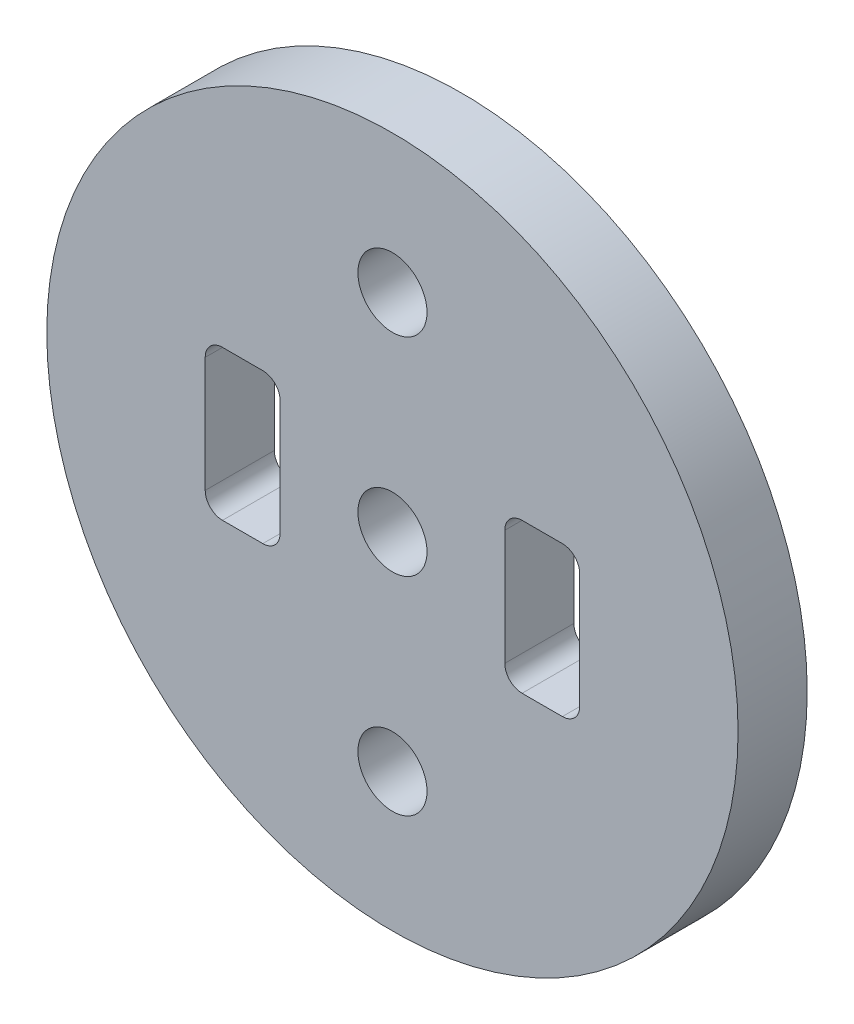
ISO-10303-21;
HEADER;
FILE_DESCRIPTION(('STEP AP214'),'2;1');
FILE_NAME('part.step','',(''),(''),'','','');
FILE_SCHEMA(('AUTOMOTIVE_DESIGN { 1 0 10303 214 1 1 1 1 }'));
ENDSEC;
DATA;
#1=APPLICATION_CONTEXT('core data for automotive mechanical design processes');
#2=APPLICATION_PROTOCOL_DEFINITION('international standard','automotive_design',2000,#1);
#3=PRODUCT_CONTEXT('',#1,'mechanical');
#4=PRODUCT('Part','Part','',(#3));
#5=PRODUCT_RELATED_PRODUCT_CATEGORY('part','',(#4));
#6=PRODUCT_DEFINITION_FORMATION('','',#4);
#7=PRODUCT_DEFINITION_CONTEXT('part definition',#1,'design');
#8=PRODUCT_DEFINITION('design','',#6,#7);
#9=PRODUCT_DEFINITION_SHAPE('','',#8);
#10=(LENGTH_UNIT() NAMED_UNIT(*) SI_UNIT(.MILLI.,.METRE.));
#11=(NAMED_UNIT(*) PLANE_ANGLE_UNIT() SI_UNIT($,.RADIAN.));
#12=(NAMED_UNIT(*) SI_UNIT($,.STERADIAN.) SOLID_ANGLE_UNIT());
#13=UNCERTAINTY_MEASURE_WITH_UNIT(LENGTH_MEASURE(1.E-05),#10,'distance_accuracy_value','');
#14=(GEOMETRIC_REPRESENTATION_CONTEXT(3) GLOBAL_UNCERTAINTY_ASSIGNED_CONTEXT((#13)) GLOBAL_UNIT_ASSIGNED_CONTEXT((#10,
#11,#12)) REPRESENTATION_CONTEXT('',''));
#15=CARTESIAN_POINT('',(0.,0.,0.));
#16=DIRECTION('',(0.,0.,1.));
#17=DIRECTION('',(1.,0.,0.));
#18=AXIS2_PLACEMENT_3D('',#15,#16,#17);
#19=CARTESIAN_POINT('',(215.7478079135,241.9520199932,3.));
#20=DIRECTION('',(0.,0.,1.));
#21=DIRECTION('',(1.,0.,0.));
#22=AXIS2_PLACEMENT_3D('',#19,#20,#21);
#23=PLANE('',#22);
#24=DIRECTION('',(0.,-1.,0.));
#25=VECTOR('',#24,1.);
#26=CARTESIAN_POINT('',(220.6228079135,244.4520199932,3.));
#27=LINE('',#26,#25);
#28=CARTESIAN_POINT('',(220.6228079135,244.4520199932,3.));
#29=VERTEX_POINT('',#28);
#30=CARTESIAN_POINT('',(220.6228079135,239.4520199932,3.));
#31=VERTEX_POINT('',#30);
#32=EDGE_CURVE('E213',#29,#31,#27,.T.);
#33=ORIENTED_EDGE('',*,*,#32,.F.);
#34=CARTESIAN_POINT('',(221.3728079135,244.4520199932,3.));
#35=DIRECTION('',(0.,0.,1.));
#36=DIRECTION('',(1.,0.,0.));
#37=AXIS2_PLACEMENT_3D('',#34,#35,#36);
#38=CIRCLE('',#37,0.750000000000001);
#39=CARTESIAN_POINT('',(221.3728079135,245.2020199932,3.));
#40=VERTEX_POINT('',#39);
#41=EDGE_CURVE('E211',#40,#29,#38,.T.);
#42=ORIENTED_EDGE('',*,*,#41,.F.);
#43=DIRECTION('',(-1.,0.,0.));
#44=VECTOR('',#43,1.);
#45=CARTESIAN_POINT('',(223.1228079135,245.2020199932,3.));
#46=LINE('',#45,#44);
#47=CARTESIAN_POINT('',(223.1228079135,245.2020199932,3.));
#48=VERTEX_POINT('',#47);
#49=EDGE_CURVE('E227',#48,#40,#46,.T.);
#50=ORIENTED_EDGE('',*,*,#49,.F.);
#51=CARTESIAN_POINT('',(223.1228079135,244.4520199932,3.));
#52=DIRECTION('',(0.,0.,1.));
#53=DIRECTION('',(1.,0.,0.));
#54=AXIS2_PLACEMENT_3D('',#51,#52,#53);
#55=CIRCLE('',#54,0.750000000000001);
#56=CARTESIAN_POINT('',(223.8728079135,244.4520199932,3.));
#57=VERTEX_POINT('',#56);
#58=EDGE_CURVE('E224',#57,#48,#55,.T.);
#59=ORIENTED_EDGE('',*,*,#58,.F.);
#60=DIRECTION('',(0.,1.,0.));
#61=VECTOR('',#60,1.);
#62=CARTESIAN_POINT('',(223.8728079135,239.4520199932,3.));
#63=LINE('',#62,#61);
#64=CARTESIAN_POINT('',(223.8728079135,239.4520199932,3.));
#65=VERTEX_POINT('',#64);
#66=EDGE_CURVE('E222',#65,#57,#63,.T.);
#67=ORIENTED_EDGE('',*,*,#66,.F.);
#68=CARTESIAN_POINT('',(223.1228079135,239.4520199932,3.));
#69=DIRECTION('',(0.,0.,1.));
#70=DIRECTION('',(1.,0.,0.));
#71=AXIS2_PLACEMENT_3D('',#68,#69,#70);
#72=CIRCLE('',#71,0.750000000000001);
#73=CARTESIAN_POINT('',(223.1228079135,238.7020199932,3.));
#74=VERTEX_POINT('',#73);
#75=EDGE_CURVE('E220',#74,#65,#72,.T.);
#76=ORIENTED_EDGE('',*,*,#75,.F.);
#77=DIRECTION('',(1.,0.,0.));
#78=VECTOR('',#77,1.);
#79=CARTESIAN_POINT('',(221.3728079135,238.7020199932,3.));
#80=LINE('',#79,#78);
#81=CARTESIAN_POINT('',(221.3728079135,238.7020199932,3.));
#82=VERTEX_POINT('',#81);
#83=EDGE_CURVE('E218',#82,#74,#80,.T.);
#84=ORIENTED_EDGE('',*,*,#83,.F.);
#85=CARTESIAN_POINT('',(221.3728079135,239.4520199932,3.));
#86=DIRECTION('',(0.,0.,1.));
#87=DIRECTION('',(1.,0.,0.));
#88=AXIS2_PLACEMENT_3D('',#85,#86,#87);
#89=CIRCLE('',#88,0.750000000000001);
#90=EDGE_CURVE('E216',#31,#82,#89,.T.);
#91=ORIENTED_EDGE('',*,*,#90,.F.);
#92=EDGE_LOOP('',(#33,#42,#50,#59,#67,#76,#84,#91));
#93=FACE_BOUND('',#92,.T.);
#94=CARTESIAN_POINT('',(215.7478079135,232.9520199932,3.));
#95=DIRECTION('',(0.,0.,1.));
#96=DIRECTION('',(1.,0.,0.));
#97=AXIS2_PLACEMENT_3D('',#94,#95,#96);
#98=CIRCLE('',#97,1.5);
#99=CARTESIAN_POINT('',(217.2478079135,232.9520199932,3.));
#100=VERTEX_POINT('',#99);
#101=EDGE_CURVE('E276',#100,#100,#98,.T.);
#102=ORIENTED_EDGE('',*,*,#101,.F.);
#103=EDGE_LOOP('',(#102));
#104=FACE_BOUND('',#103,.T.);
#105=CARTESIAN_POINT('',(215.7478079135,241.9520199932,3.));
#106=DIRECTION('',(0.,0.,1.));
#107=DIRECTION('',(1.,0.,0.));
#108=AXIS2_PLACEMENT_3D('',#105,#106,#107);
#109=CIRCLE('',#108,15.);
#110=CARTESIAN_POINT('',(230.7478079135,241.9520199932,3.));
#111=VERTEX_POINT('',#110);
#112=EDGE_CURVE('E11',#111,#111,#109,.T.);
#113=ORIENTED_EDGE('',*,*,#112,.T.);
#114=EDGE_LOOP('',(#113));
#115=FACE_BOUND('',#114,.T.);
#116=CARTESIAN_POINT('',(215.7478079135,241.9520199932,3.));
#117=DIRECTION('',(0.,0.,1.));
#118=DIRECTION('',(1.,0.,0.));
#119=AXIS2_PLACEMENT_3D('',#116,#117,#118);
#120=CIRCLE('',#119,1.5);
#121=CARTESIAN_POINT('',(217.2478079135,241.9520199932,3.));
#122=VERTEX_POINT('',#121);
#123=EDGE_CURVE('E282',#122,#122,#120,.T.);
#124=ORIENTED_EDGE('',*,*,#123,.F.);
#125=EDGE_LOOP('',(#124));
#126=FACE_BOUND('',#125,.T.);
#127=CARTESIAN_POINT('',(215.7478079135,250.9520199932,3.));
#128=DIRECTION('',(0.,0.,1.));
#129=DIRECTION('',(1.,0.,0.));
#130=AXIS2_PLACEMENT_3D('',#127,#128,#129);
#131=CIRCLE('',#130,1.5);
#132=CARTESIAN_POINT('',(217.2478079135,250.9520199932,3.));
#133=VERTEX_POINT('',#132);
#134=EDGE_CURVE('E270',#133,#133,#131,.T.);
#135=ORIENTED_EDGE('',*,*,#134,.F.);
#136=EDGE_LOOP('',(#135));
#137=FACE_BOUND('',#136,.T.);
#138=DIRECTION('',(-1.,0.,0.));
#139=VECTOR('',#138,1.);
#140=CARTESIAN_POINT('',(208.3728079135,245.2020199932,3.));
#141=LINE('',#140,#139);
#142=CARTESIAN_POINT('',(210.1228079135,245.2020199932,3.));
#143=VERTEX_POINT('',#142);
#144=CARTESIAN_POINT('',(208.3728079135,245.2020199932,3.));
#145=VERTEX_POINT('',#144);
#146=EDGE_CURVE('E154',#143,#145,#141,.T.);
#147=ORIENTED_EDGE('',*,*,#146,.F.);
#148=CARTESIAN_POINT('',(210.1228079135,244.4520199932,3.));
#149=DIRECTION('',(0.,0.,1.));
#150=DIRECTION('',(1.,0.,0.));
#151=AXIS2_PLACEMENT_3D('',#148,#149,#150);
#152=CIRCLE('',#151,0.750000000000001);
#153=CARTESIAN_POINT('',(210.8728079135,244.4520199932,3.));
#154=VERTEX_POINT('',#153);
#155=EDGE_CURVE('E146',#154,#143,#152,.T.);
#156=ORIENTED_EDGE('',*,*,#155,.F.);
#157=DIRECTION('',(0.,1.,0.));
#158=VECTOR('',#157,1.);
#159=CARTESIAN_POINT('',(210.8728079135,244.4520199932,3.));
#160=LINE('',#159,#158);
#161=CARTESIAN_POINT('',(210.8728079135,239.4520199932,3.));
#162=VERTEX_POINT('',#161);
#163=EDGE_CURVE('E179',#162,#154,#160,.T.);
#164=ORIENTED_EDGE('',*,*,#163,.F.);
#165=CARTESIAN_POINT('',(210.1228079135,239.4520199932,3.));
#166=DIRECTION('',(0.,0.,1.));
#167=DIRECTION('',(1.,0.,0.));
#168=AXIS2_PLACEMENT_3D('',#165,#166,#167);
#169=CIRCLE('',#168,0.750000000000001);
#170=CARTESIAN_POINT('',(210.1228079135,238.7020199932,3.));
#171=VERTEX_POINT('',#170);
#172=EDGE_CURVE('E177',#171,#162,#169,.T.);
#173=ORIENTED_EDGE('',*,*,#172,.F.);
#174=DIRECTION('',(1.,0.,0.));
#175=VECTOR('',#174,1.);
#176=CARTESIAN_POINT('',(210.1228079135,238.7020199932,3.));
#177=LINE('',#176,#175);
#178=CARTESIAN_POINT('',(208.3728079135,238.7020199932,3.));
#179=VERTEX_POINT('',#178);
#180=EDGE_CURVE('E175',#179,#171,#177,.T.);
#181=ORIENTED_EDGE('',*,*,#180,.F.);
#182=CARTESIAN_POINT('',(208.3728079135,239.4520199932,3.));
#183=DIRECTION('',(0.,0.,1.));
#184=DIRECTION('',(1.,0.,0.));
#185=AXIS2_PLACEMENT_3D('',#182,#183,#184);
#186=CIRCLE('',#185,0.750000000000237);
#187=CARTESIAN_POINT('',(207.6228079135,239.4520199932,3.));
#188=VERTEX_POINT('',#187);
#189=EDGE_CURVE('E173',#188,#179,#186,.T.);
#190=ORIENTED_EDGE('',*,*,#189,.F.);
#191=DIRECTION('',(0.,-1.,0.));
#192=VECTOR('',#191,1.);
#193=CARTESIAN_POINT('',(207.6228079135,239.4520199932,3.));
#194=LINE('',#193,#192);
#195=CARTESIAN_POINT('',(207.6228079135,244.4520199932,3.));
#196=VERTEX_POINT('',#195);
#197=EDGE_CURVE('E169',#196,#188,#194,.T.);
#198=ORIENTED_EDGE('',*,*,#197,.F.);
#199=CARTESIAN_POINT('',(208.3728079135,244.4520199932,3.));
#200=DIRECTION('',(0.,0.,1.));
#201=DIRECTION('',(1.,0.,0.));
#202=AXIS2_PLACEMENT_3D('',#199,#200,#201);
#203=CIRCLE('',#202,0.750000000000001);
#204=EDGE_CURVE('E167',#145,#196,#203,.T.);
#205=ORIENTED_EDGE('',*,*,#204,.F.);
#206=EDGE_LOOP('',(#147,#156,#164,#173,#181,#190,#198,#205));
#207=FACE_BOUND('',#206,.T.);
#208=ADVANCED_FACE('F33',(#93,#104,#115,#126,#137,#207),#23,.T.);
#209=CARTESIAN_POINT('',(215.7478079135,241.9520199932,0.));
#210=DIRECTION('',(0.,0.,1.));
#211=DIRECTION('',(1.,0.,0.));
#212=AXIS2_PLACEMENT_3D('',#209,#210,#211);
#213=PLANE('',#212);
#214=CARTESIAN_POINT('',(221.3728079135,244.4520199932,0.));
#215=DIRECTION('',(0.,0.,1.));
#216=DIRECTION('',(1.,0.,0.));
#217=AXIS2_PLACEMENT_3D('',#214,#215,#216);
#218=CIRCLE('',#217,0.750000000000001);
#219=CARTESIAN_POINT('',(221.3728079135,245.2020199932,0.));
#220=VERTEX_POINT('',#219);
#221=CARTESIAN_POINT('',(220.6228079135,244.4520199932,0.));
#222=VERTEX_POINT('',#221);
#223=EDGE_CURVE('E162',#220,#222,#218,.T.);
#224=ORIENTED_EDGE('',*,*,#223,.T.);
#225=DIRECTION('',(0.,-1.,0.));
#226=VECTOR('',#225,1.);
#227=CARTESIAN_POINT('',(220.6228079135,244.4520199932,0.));
#228=LINE('',#227,#226);
#229=CARTESIAN_POINT('',(220.6228079135,239.4520199932,0.));
#230=VERTEX_POINT('',#229);
#231=EDGE_CURVE('E232',#222,#230,#228,.T.);
#232=ORIENTED_EDGE('',*,*,#231,.T.);
#233=CARTESIAN_POINT('',(221.3728079135,239.4520199932,0.));
#234=DIRECTION('',(0.,0.,1.));
#235=DIRECTION('',(1.,0.,0.));
#236=AXIS2_PLACEMENT_3D('',#233,#234,#235);
#237=CIRCLE('',#236,0.750000000000001);
#238=CARTESIAN_POINT('',(221.3728079135,238.7020199932,0.));
#239=VERTEX_POINT('',#238);
#240=EDGE_CURVE('E235',#230,#239,#237,.T.);
#241=ORIENTED_EDGE('',*,*,#240,.T.);
#242=DIRECTION('',(1.,0.,0.));
#243=VECTOR('',#242,1.);
#244=CARTESIAN_POINT('',(221.3728079135,238.7020199932,0.));
#245=LINE('',#244,#243);
#246=CARTESIAN_POINT('',(223.1228079135,238.7020199932,0.));
#247=VERTEX_POINT('',#246);
#248=EDGE_CURVE('E238',#239,#247,#245,.T.);
#249=ORIENTED_EDGE('',*,*,#248,.T.);
#250=CARTESIAN_POINT('',(223.1228079135,239.4520199932,0.));
#251=DIRECTION('',(0.,0.,1.));
#252=DIRECTION('',(1.,0.,0.));
#253=AXIS2_PLACEMENT_3D('',#250,#251,#252);
#254=CIRCLE('',#253,0.750000000000001);
#255=CARTESIAN_POINT('',(223.8728079135,239.4520199932,0.));
#256=VERTEX_POINT('',#255);
#257=EDGE_CURVE('E241',#247,#256,#254,.T.);
#258=ORIENTED_EDGE('',*,*,#257,.T.);
#259=DIRECTION('',(0.,1.,0.));
#260=VECTOR('',#259,1.);
#261=CARTESIAN_POINT('',(223.8728079135,239.4520199932,0.));
#262=LINE('',#261,#260);
#263=CARTESIAN_POINT('',(223.8728079135,244.4520199932,0.));
#264=VERTEX_POINT('',#263);
#265=EDGE_CURVE('E244',#256,#264,#262,.T.);
#266=ORIENTED_EDGE('',*,*,#265,.T.);
#267=CARTESIAN_POINT('',(223.1228079135,244.4520199932,0.));
#268=DIRECTION('',(0.,0.,1.));
#269=DIRECTION('',(1.,0.,0.));
#270=AXIS2_PLACEMENT_3D('',#267,#268,#269);
#271=CIRCLE('',#270,0.750000000000001);
#272=CARTESIAN_POINT('',(223.1228079135,245.2020199932,0.));
#273=VERTEX_POINT('',#272);
#274=EDGE_CURVE('E247',#264,#273,#271,.T.);
#275=ORIENTED_EDGE('',*,*,#274,.T.);
#276=DIRECTION('',(-1.,0.,0.));
#277=VECTOR('',#276,1.);
#278=CARTESIAN_POINT('',(223.1228079135,245.2020199932,0.));
#279=LINE('',#278,#277);
#280=EDGE_CURVE('E214',#273,#220,#279,.T.);
#281=ORIENTED_EDGE('',*,*,#280,.T.);
#282=EDGE_LOOP('',(#224,#232,#241,#249,#258,#266,#275,#281));
#283=FACE_BOUND('',#282,.T.);
#284=CARTESIAN_POINT('',(215.7478079135,232.9520199932,0.));
#285=DIRECTION('',(0.,0.,1.));
#286=DIRECTION('',(1.,0.,0.));
#287=AXIS2_PLACEMENT_3D('',#284,#285,#286);
#288=CIRCLE('',#287,1.5);
#289=CARTESIAN_POINT('',(217.2478079135,232.9520199932,0.));
#290=VERTEX_POINT('',#289);
#291=EDGE_CURVE('E273',#290,#290,#288,.T.);
#292=ORIENTED_EDGE('',*,*,#291,.T.);
#293=EDGE_LOOP('',(#292));
#294=FACE_BOUND('',#293,.T.);
#295=CARTESIAN_POINT('',(215.7478079135,241.9520199932,0.));
#296=DIRECTION('',(0.,0.,1.));
#297=DIRECTION('',(1.,0.,0.));
#298=AXIS2_PLACEMENT_3D('',#295,#296,#297);
#299=CIRCLE('',#298,15.);
#300=CARTESIAN_POINT('',(230.7478079135,241.9520199932,0.));
#301=VERTEX_POINT('',#300);
#302=EDGE_CURVE('E37',#301,#301,#299,.T.);
#303=ORIENTED_EDGE('',*,*,#302,.F.);
#304=EDGE_LOOP('',(#303));
#305=FACE_BOUND('',#304,.T.);
#306=CARTESIAN_POINT('',(215.7478079135,241.9520199932,0.));
#307=DIRECTION('',(0.,0.,1.));
#308=DIRECTION('',(1.,0.,0.));
#309=AXIS2_PLACEMENT_3D('',#306,#307,#308);
#310=CIRCLE('',#309,1.5);
#311=CARTESIAN_POINT('',(217.2478079135,241.9520199932,0.));
#312=VERTEX_POINT('',#311);
#313=EDGE_CURVE('E279',#312,#312,#310,.T.);
#314=ORIENTED_EDGE('',*,*,#313,.T.);
#315=EDGE_LOOP('',(#314));
#316=FACE_BOUND('',#315,.T.);
#317=CARTESIAN_POINT('',(215.7478079135,250.9520199932,0.));
#318=DIRECTION('',(0.,0.,1.));
#319=DIRECTION('',(1.,0.,0.));
#320=AXIS2_PLACEMENT_3D('',#317,#318,#319);
#321=CIRCLE('',#320,1.5);
#322=CARTESIAN_POINT('',(217.2478079135,250.9520199932,0.));
#323=VERTEX_POINT('',#322);
#324=EDGE_CURVE('E269',#323,#323,#321,.T.);
#325=ORIENTED_EDGE('',*,*,#324,.T.);
#326=EDGE_LOOP('',(#325));
#327=FACE_BOUND('',#326,.T.);
#328=CARTESIAN_POINT('',(210.1228079135,244.4520199932,0.));
#329=DIRECTION('',(0.,0.,1.));
#330=DIRECTION('',(1.,0.,0.));
#331=AXIS2_PLACEMENT_3D('',#328,#329,#330);
#332=CIRCLE('',#331,0.750000000000001);
#333=CARTESIAN_POINT('',(210.8728079135,244.4520199932,0.));
#334=VERTEX_POINT('',#333);
#335=CARTESIAN_POINT('',(210.1228079135,245.2020199932,0.));
#336=VERTEX_POINT('',#335);
#337=EDGE_CURVE('E56',#334,#336,#332,.T.);
#338=ORIENTED_EDGE('',*,*,#337,.T.);
#339=DIRECTION('',(-1.,0.,0.));
#340=VECTOR('',#339,1.);
#341=CARTESIAN_POINT('',(208.3728079135,245.2020199932,0.));
#342=LINE('',#341,#340);
#343=CARTESIAN_POINT('',(208.3728079135,245.2020199932,0.));
#344=VERTEX_POINT('',#343);
#345=EDGE_CURVE('E161',#336,#344,#342,.T.);
#346=ORIENTED_EDGE('',*,*,#345,.T.);
#347=CARTESIAN_POINT('',(208.3728079135,244.4520199932,0.));
#348=DIRECTION('',(0.,0.,1.));
#349=DIRECTION('',(1.,0.,0.));
#350=AXIS2_PLACEMENT_3D('',#347,#348,#349);
#351=CIRCLE('',#350,0.750000000000001);
#352=CARTESIAN_POINT('',(207.6228079135,244.4520199932,0.));
#353=VERTEX_POINT('',#352);
#354=EDGE_CURVE('E183',#344,#353,#351,.T.);
#355=ORIENTED_EDGE('',*,*,#354,.T.);
#356=DIRECTION('',(0.,-1.,0.));
#357=VECTOR('',#356,1.);
#358=CARTESIAN_POINT('',(207.6228079135,239.4520199932,0.));
#359=LINE('',#358,#357);
#360=CARTESIAN_POINT('',(207.6228079135,239.4520199932,0.));
#361=VERTEX_POINT('',#360);
#362=EDGE_CURVE('E186',#353,#361,#359,.T.);
#363=ORIENTED_EDGE('',*,*,#362,.T.);
#364=CARTESIAN_POINT('',(208.3728079135,239.4520199932,0.));
#365=DIRECTION('',(0.,0.,1.));
#366=DIRECTION('',(1.,0.,0.));
#367=AXIS2_PLACEMENT_3D('',#364,#365,#366);
#368=CIRCLE('',#367,0.750000000000237);
#369=CARTESIAN_POINT('',(208.3728079135,238.7020199932,0.));
#370=VERTEX_POINT('',#369);
#371=EDGE_CURVE('E189',#361,#370,#368,.T.);
#372=ORIENTED_EDGE('',*,*,#371,.T.);
#373=DIRECTION('',(1.,0.,0.));
#374=VECTOR('',#373,1.);
#375=CARTESIAN_POINT('',(210.1228079135,238.7020199932,0.));
#376=LINE('',#375,#374);
#377=CARTESIAN_POINT('',(210.1228079135,238.7020199932,0.));
#378=VERTEX_POINT('',#377);
#379=EDGE_CURVE('E192',#370,#378,#376,.T.);
#380=ORIENTED_EDGE('',*,*,#379,.T.);
#381=CARTESIAN_POINT('',(210.1228079135,239.4520199932,0.));
#382=DIRECTION('',(0.,0.,1.));
#383=DIRECTION('',(1.,0.,0.));
#384=AXIS2_PLACEMENT_3D('',#381,#382,#383);
#385=CIRCLE('',#384,0.750000000000001);
#386=CARTESIAN_POINT('',(210.8728079135,239.4520199932,0.));
#387=VERTEX_POINT('',#386);
#388=EDGE_CURVE('E195',#378,#387,#385,.T.);
#389=ORIENTED_EDGE('',*,*,#388,.T.);
#390=DIRECTION('',(0.,1.,0.));
#391=VECTOR('',#390,1.);
#392=CARTESIAN_POINT('',(210.8728079135,244.4520199932,0.));
#393=LINE('',#392,#391);
#394=EDGE_CURVE('E155',#387,#334,#393,.T.);
#395=ORIENTED_EDGE('',*,*,#394,.T.);
#396=EDGE_LOOP('',(#338,#346,#355,#363,#372,#380,#389,#395));
#397=FACE_BOUND('',#396,.T.);
#398=ADVANCED_FACE('F288',(#283,#294,#305,#316,#327,#397),#213,.F.);
#399=CARTESIAN_POINT('',(215.7478079135,241.9520199932,3.));
#400=DIRECTION('',(0.,0.,-1.));
#401=DIRECTION('',(-1.,0.,0.));
#402=AXIS2_PLACEMENT_3D('',#399,#400,#401);
#403=CYLINDRICAL_SURFACE('',#402,15.);
#404=ORIENTED_EDGE('',*,*,#112,.F.);
#405=EDGE_LOOP('',(#404));
#406=FACE_BOUND('',#405,.T.);
#407=ORIENTED_EDGE('',*,*,#302,.T.);
#408=EDGE_LOOP('',(#407));
#409=FACE_BOUND('',#408,.T.);
#410=ADVANCED_FACE('F35',(#406,#409),#403,.T.);
#411=CARTESIAN_POINT('',(215.7478079135,241.9520199932,3.));
#412=DIRECTION('',(0.,0.,-1.));
#413=DIRECTION('',(-1.,0.,0.));
#414=AXIS2_PLACEMENT_3D('',#411,#412,#413);
#415=CYLINDRICAL_SURFACE('',#414,1.5);
#416=ORIENTED_EDGE('',*,*,#123,.T.);
#417=EDGE_LOOP('',(#416));
#418=FACE_BOUND('',#417,.T.);
#419=ORIENTED_EDGE('',*,*,#313,.F.);
#420=EDGE_LOOP('',(#419));
#421=FACE_BOUND('',#420,.T.);
#422=ADVANCED_FACE('F291',(#418,#421),#415,.F.);
#423=CARTESIAN_POINT('',(215.7478079135,232.9520199932,3.));
#424=DIRECTION('',(0.,0.,-1.));
#425=DIRECTION('',(-1.,0.,0.));
#426=AXIS2_PLACEMENT_3D('',#423,#424,#425);
#427=CYLINDRICAL_SURFACE('',#426,1.5);
#428=ORIENTED_EDGE('',*,*,#101,.T.);
#429=EDGE_LOOP('',(#428));
#430=FACE_BOUND('',#429,.T.);
#431=ORIENTED_EDGE('',*,*,#291,.F.);
#432=EDGE_LOOP('',(#431));
#433=FACE_BOUND('',#432,.T.);
#434=ADVANCED_FACE('F293',(#430,#433),#427,.F.);
#435=CARTESIAN_POINT('',(215.7478079135,250.9520199932,3.));
#436=DIRECTION('',(0.,0.,-1.));
#437=DIRECTION('',(-1.,0.,0.));
#438=AXIS2_PLACEMENT_3D('',#435,#436,#437);
#439=CYLINDRICAL_SURFACE('',#438,1.5);
#440=ORIENTED_EDGE('',*,*,#134,.T.);
#441=EDGE_LOOP('',(#440));
#442=FACE_BOUND('',#441,.T.);
#443=ORIENTED_EDGE('',*,*,#324,.F.);
#444=EDGE_LOOP('',(#443));
#445=FACE_BOUND('',#444,.T.);
#446=ADVANCED_FACE('F300',(#442,#445),#439,.F.);
#447=CARTESIAN_POINT('',(221.3728079135,244.4520199932,3.));
#448=DIRECTION('',(0.,0.,-1.));
#449=DIRECTION('',(-1.,0.,0.));
#450=AXIS2_PLACEMENT_3D('',#447,#448,#449);
#451=CYLINDRICAL_SURFACE('',#450,0.750000000000001);
#452=ORIENTED_EDGE('',*,*,#223,.F.);
#453=DIRECTION('',(0.,0.,-1.));
#454=VECTOR('',#453,1.);
#455=CARTESIAN_POINT('',(221.3728079135,245.2020199932,3.));
#456=LINE('',#455,#454);
#457=EDGE_CURVE('E229',#40,#220,#456,.T.);
#458=ORIENTED_EDGE('',*,*,#457,.F.);
#459=ORIENTED_EDGE('',*,*,#41,.T.);
#460=DIRECTION('',(0.,0.,-1.));
#461=VECTOR('',#460,1.);
#462=CARTESIAN_POINT('',(220.6228079135,244.4520199932,3.));
#463=LINE('',#462,#461);
#464=EDGE_CURVE('E266',#29,#222,#463,.T.);
#465=ORIENTED_EDGE('',*,*,#464,.T.);
#466=EDGE_LOOP('',(#452,#458,#459,#465));
#467=FACE_BOUND('',#466,.T.);
#468=ADVANCED_FACE('F325',(#467),#451,.F.);
#469=CARTESIAN_POINT('',(220.6228079135,244.4520199932,3.));
#470=DIRECTION('',(1.,0.,0.));
#471=DIRECTION('',(0.,0.,-1.));
#472=AXIS2_PLACEMENT_3D('',#469,#470,#471);
#473=PLANE('',#472);
#474=ORIENTED_EDGE('',*,*,#231,.F.);
#475=ORIENTED_EDGE('',*,*,#464,.F.);
#476=ORIENTED_EDGE('',*,*,#32,.T.);
#477=DIRECTION('',(0.,0.,-1.));
#478=VECTOR('',#477,1.);
#479=CARTESIAN_POINT('',(220.6228079135,239.4520199932,3.));
#480=LINE('',#479,#478);
#481=EDGE_CURVE('E264',#31,#230,#480,.T.);
#482=ORIENTED_EDGE('',*,*,#481,.T.);
#483=EDGE_LOOP('',(#474,#475,#476,#482));
#484=FACE_BOUND('',#483,.T.);
#485=ADVANCED_FACE('F387',(#484),#473,.T.);
#486=CARTESIAN_POINT('',(221.3728079135,239.4520199932,3.));
#487=DIRECTION('',(0.,0.,-1.));
#488=DIRECTION('',(-1.,0.,0.));
#489=AXIS2_PLACEMENT_3D('',#486,#487,#488);
#490=CYLINDRICAL_SURFACE('',#489,0.750000000000001);
#491=ORIENTED_EDGE('',*,*,#240,.F.);
#492=ORIENTED_EDGE('',*,*,#481,.F.);
#493=ORIENTED_EDGE('',*,*,#90,.T.);
#494=DIRECTION('',(0.,0.,-1.));
#495=VECTOR('',#494,1.);
#496=CARTESIAN_POINT('',(221.3728079135,238.7020199932,3.));
#497=LINE('',#496,#495);
#498=EDGE_CURVE('E262',#82,#239,#497,.T.);
#499=ORIENTED_EDGE('',*,*,#498,.T.);
#500=EDGE_LOOP('',(#491,#492,#493,#499));
#501=FACE_BOUND('',#500,.T.);
#502=ADVANCED_FACE('F383',(#501),#490,.F.);
#503=CARTESIAN_POINT('',(221.3728079135,238.7020199932,3.));
#504=DIRECTION('',(0.,1.,0.));
#505=DIRECTION('',(0.,0.,1.));
#506=AXIS2_PLACEMENT_3D('',#503,#504,#505);
#507=PLANE('',#506);
#508=ORIENTED_EDGE('',*,*,#248,.F.);
#509=ORIENTED_EDGE('',*,*,#498,.F.);
#510=ORIENTED_EDGE('',*,*,#83,.T.);
#511=DIRECTION('',(0.,0.,-1.));
#512=VECTOR('',#511,1.);
#513=CARTESIAN_POINT('',(223.1228079135,238.7020199932,3.));
#514=LINE('',#513,#512);
#515=EDGE_CURVE('E260',#74,#247,#514,.T.);
#516=ORIENTED_EDGE('',*,*,#515,.T.);
#517=EDGE_LOOP('',(#508,#509,#510,#516));
#518=FACE_BOUND('',#517,.T.);
#519=ADVANCED_FACE('F379',(#518),#507,.T.);
#520=CARTESIAN_POINT('',(223.1228079135,239.4520199932,3.));
#521=DIRECTION('',(0.,0.,-1.));
#522=DIRECTION('',(-1.,0.,0.));
#523=AXIS2_PLACEMENT_3D('',#520,#521,#522);
#524=CYLINDRICAL_SURFACE('',#523,0.750000000000001);
#525=ORIENTED_EDGE('',*,*,#257,.F.);
#526=ORIENTED_EDGE('',*,*,#515,.F.);
#527=ORIENTED_EDGE('',*,*,#75,.T.);
#528=DIRECTION('',(0.,0.,-1.));
#529=VECTOR('',#528,1.);
#530=CARTESIAN_POINT('',(223.8728079135,239.4520199932,3.));
#531=LINE('',#530,#529);
#532=EDGE_CURVE('E258',#65,#256,#531,.T.);
#533=ORIENTED_EDGE('',*,*,#532,.T.);
#534=EDGE_LOOP('',(#525,#526,#527,#533));
#535=FACE_BOUND('',#534,.T.);
#536=ADVANCED_FACE('F375',(#535),#524,.F.);
#537=CARTESIAN_POINT('',(223.8728079135,239.4520199932,3.));
#538=DIRECTION('',(-1.,0.,0.));
#539=DIRECTION('',(0.,0.,1.));
#540=AXIS2_PLACEMENT_3D('',#537,#538,#539);
#541=PLANE('',#540);
#542=ORIENTED_EDGE('',*,*,#265,.F.);
#543=ORIENTED_EDGE('',*,*,#532,.F.);
#544=ORIENTED_EDGE('',*,*,#66,.T.);
#545=DIRECTION('',(0.,0.,-1.));
#546=VECTOR('',#545,1.);
#547=CARTESIAN_POINT('',(223.8728079135,244.4520199932,3.));
#548=LINE('',#547,#546);
#549=EDGE_CURVE('E256',#57,#264,#548,.T.);
#550=ORIENTED_EDGE('',*,*,#549,.T.);
#551=EDGE_LOOP('',(#542,#543,#544,#550));
#552=FACE_BOUND('',#551,.T.);
#553=ADVANCED_FACE('F371',(#552),#541,.T.);
#554=CARTESIAN_POINT('',(223.1228079135,244.4520199932,3.));
#555=DIRECTION('',(0.,0.,-1.));
#556=DIRECTION('',(-1.,0.,0.));
#557=AXIS2_PLACEMENT_3D('',#554,#555,#556);
#558=CYLINDRICAL_SURFACE('',#557,0.750000000000001);
#559=ORIENTED_EDGE('',*,*,#274,.F.);
#560=ORIENTED_EDGE('',*,*,#549,.F.);
#561=ORIENTED_EDGE('',*,*,#58,.T.);
#562=DIRECTION('',(0.,0.,-1.));
#563=VECTOR('',#562,1.);
#564=CARTESIAN_POINT('',(223.1228079135,245.2020199932,3.));
#565=LINE('',#564,#563);
#566=EDGE_CURVE('E254',#48,#273,#565,.T.);
#567=ORIENTED_EDGE('',*,*,#566,.T.);
#568=EDGE_LOOP('',(#559,#560,#561,#567));
#569=FACE_BOUND('',#568,.T.);
#570=ADVANCED_FACE('F367',(#569),#558,.F.);
#571=CARTESIAN_POINT('',(223.1228079135,245.2020199932,3.));
#572=DIRECTION('',(0.,-1.,0.));
#573=DIRECTION('',(0.,0.,-1.));
#574=AXIS2_PLACEMENT_3D('',#571,#572,#573);
#575=PLANE('',#574);
#576=ORIENTED_EDGE('',*,*,#280,.F.);
#577=ORIENTED_EDGE('',*,*,#566,.F.);
#578=ORIENTED_EDGE('',*,*,#49,.T.);
#579=ORIENTED_EDGE('',*,*,#457,.T.);
#580=EDGE_LOOP('',(#576,#577,#578,#579));
#581=FACE_BOUND('',#580,.T.);
#582=ADVANCED_FACE('F364',(#581),#575,.T.);
#583=CARTESIAN_POINT('',(210.1228079135,244.4520199932,3.));
#584=DIRECTION('',(0.,0.,-1.));
#585=DIRECTION('',(-1.,0.,0.));
#586=AXIS2_PLACEMENT_3D('',#583,#584,#585);
#587=CYLINDRICAL_SURFACE('',#586,0.750000000000001);
#588=ORIENTED_EDGE('',*,*,#337,.F.);
#589=DIRECTION('',(0.,0.,-1.));
#590=VECTOR('',#589,1.);
#591=CARTESIAN_POINT('',(210.8728079135,244.4520199932,3.));
#592=LINE('',#591,#590);
#593=EDGE_CURVE('E150',#154,#334,#592,.T.);
#594=ORIENTED_EDGE('',*,*,#593,.F.);
#595=ORIENTED_EDGE('',*,*,#155,.T.);
#596=DIRECTION('',(0.,0.,-1.));
#597=VECTOR('',#596,1.);
#598=CARTESIAN_POINT('',(210.1228079135,245.2020199932,3.));
#599=LINE('',#598,#597);
#600=EDGE_CURVE('E149',#143,#336,#599,.T.);
#601=ORIENTED_EDGE('',*,*,#600,.T.);
#602=EDGE_LOOP('',(#588,#594,#595,#601));
#603=FACE_BOUND('',#602,.T.);
#604=ADVANCED_FACE('F148',(#603),#587,.F.);
#605=CARTESIAN_POINT('',(208.3728079135,245.2020199932,3.));
#606=DIRECTION('',(0.,-1.,0.));
#607=DIRECTION('',(0.,0.,-1.));
#608=AXIS2_PLACEMENT_3D('',#605,#606,#607);
#609=PLANE('',#608);
#610=ORIENTED_EDGE('',*,*,#345,.F.);
#611=ORIENTED_EDGE('',*,*,#600,.F.);
#612=ORIENTED_EDGE('',*,*,#146,.T.);
#613=DIRECTION('',(0.,0.,-1.));
#614=VECTOR('',#613,1.);
#615=CARTESIAN_POINT('',(208.3728079135,245.2020199932,3.));
#616=LINE('',#615,#614);
#617=EDGE_CURVE('E163',#145,#344,#616,.T.);
#618=ORIENTED_EDGE('',*,*,#617,.T.);
#619=EDGE_LOOP('',(#610,#611,#612,#618));
#620=FACE_BOUND('',#619,.T.);
#621=ADVANCED_FACE('F158',(#620),#609,.T.);
#622=CARTESIAN_POINT('',(208.3728079135,244.4520199932,3.));
#623=DIRECTION('',(0.,0.,-1.));
#624=DIRECTION('',(-1.,0.,0.));
#625=AXIS2_PLACEMENT_3D('',#622,#623,#624);
#626=CYLINDRICAL_SURFACE('',#625,0.750000000000001);
#627=ORIENTED_EDGE('',*,*,#354,.F.);
#628=ORIENTED_EDGE('',*,*,#617,.F.);
#629=ORIENTED_EDGE('',*,*,#204,.T.);
#630=DIRECTION('',(0.,0.,-1.));
#631=VECTOR('',#630,1.);
#632=CARTESIAN_POINT('',(207.6228079135,244.4520199932,3.));
#633=LINE('',#632,#631);
#634=EDGE_CURVE('E208',#196,#353,#633,.T.);
#635=ORIENTED_EDGE('',*,*,#634,.T.);
#636=EDGE_LOOP('',(#627,#628,#629,#635));
#637=FACE_BOUND('',#636,.T.);
#638=ADVANCED_FACE('F351',(#637),#626,.F.);
#639=CARTESIAN_POINT('',(207.6228079135,239.4520199932,3.));
#640=DIRECTION('',(1.,0.,0.));
#641=DIRECTION('',(0.,0.,-1.));
#642=AXIS2_PLACEMENT_3D('',#639,#640,#641);
#643=PLANE('',#642);
#644=ORIENTED_EDGE('',*,*,#362,.F.);
#645=ORIENTED_EDGE('',*,*,#634,.F.);
#646=ORIENTED_EDGE('',*,*,#197,.T.);
#647=DIRECTION('',(0.,0.,-1.));
#648=VECTOR('',#647,1.);
#649=CARTESIAN_POINT('',(207.6228079135,239.4520199932,3.));
#650=LINE('',#649,#648);
#651=EDGE_CURVE('E206',#188,#361,#650,.T.);
#652=ORIENTED_EDGE('',*,*,#651,.T.);
#653=EDGE_LOOP('',(#644,#645,#646,#652));
#654=FACE_BOUND('',#653,.T.);
#655=ADVANCED_FACE('F348',(#654),#643,.T.);
#656=CARTESIAN_POINT('',(208.3728079135,239.4520199932,3.));
#657=DIRECTION('',(0.,0.,-1.));
#658=DIRECTION('',(-1.,0.,0.));
#659=AXIS2_PLACEMENT_3D('',#656,#657,#658);
#660=CYLINDRICAL_SURFACE('',#659,0.750000000000237);
#661=ORIENTED_EDGE('',*,*,#371,.F.);
#662=ORIENTED_EDGE('',*,*,#651,.F.);
#663=ORIENTED_EDGE('',*,*,#189,.T.);
#664=DIRECTION('',(0.,0.,-1.));
#665=VECTOR('',#664,1.);
#666=CARTESIAN_POINT('',(208.3728079135,238.7020199932,3.));
#667=LINE('',#666,#665);
#668=EDGE_CURVE('E204',#179,#370,#667,.T.);
#669=ORIENTED_EDGE('',*,*,#668,.T.);
#670=EDGE_LOOP('',(#661,#662,#663,#669));
#671=FACE_BOUND('',#670,.T.);
#672=ADVANCED_FACE('F343',(#671),#660,.F.);
#673=CARTESIAN_POINT('',(210.1228079135,238.7020199932,3.));
#674=DIRECTION('',(0.,1.,0.));
#675=DIRECTION('',(0.,0.,1.));
#676=AXIS2_PLACEMENT_3D('',#673,#674,#675);
#677=PLANE('',#676);
#678=ORIENTED_EDGE('',*,*,#379,.F.);
#679=ORIENTED_EDGE('',*,*,#668,.F.);
#680=ORIENTED_EDGE('',*,*,#180,.T.);
#681=DIRECTION('',(0.,0.,-1.));
#682=VECTOR('',#681,1.);
#683=CARTESIAN_POINT('',(210.1228079135,238.7020199932,3.));
#684=LINE('',#683,#682);
#685=EDGE_CURVE('E202',#171,#378,#684,.T.);
#686=ORIENTED_EDGE('',*,*,#685,.T.);
#687=EDGE_LOOP('',(#678,#679,#680,#686));
#688=FACE_BOUND('',#687,.T.);
#689=ADVANCED_FACE('F339',(#688),#677,.T.);
#690=CARTESIAN_POINT('',(210.1228079135,239.4520199932,3.));
#691=DIRECTION('',(0.,0.,-1.));
#692=DIRECTION('',(-1.,0.,0.));
#693=AXIS2_PLACEMENT_3D('',#690,#691,#692);
#694=CYLINDRICAL_SURFACE('',#693,0.750000000000001);
#695=ORIENTED_EDGE('',*,*,#388,.F.);
#696=ORIENTED_EDGE('',*,*,#685,.F.);
#697=ORIENTED_EDGE('',*,*,#172,.T.);
#698=DIRECTION('',(0.,0.,-1.));
#699=VECTOR('',#698,1.);
#700=CARTESIAN_POINT('',(210.8728079135,239.4520199932,3.));
#701=LINE('',#700,#699);
#702=EDGE_CURVE('E48',#162,#387,#701,.T.);
#703=ORIENTED_EDGE('',*,*,#702,.T.);
#704=EDGE_LOOP('',(#695,#696,#697,#703));
#705=FACE_BOUND('',#704,.T.);
#706=ADVANCED_FACE('F336',(#705),#694,.F.);
#707=CARTESIAN_POINT('',(210.8728079135,244.4520199932,3.));
#708=DIRECTION('',(-1.,0.,0.));
#709=DIRECTION('',(0.,0.,1.));
#710=AXIS2_PLACEMENT_3D('',#707,#708,#709);
#711=PLANE('',#710);
#712=ORIENTED_EDGE('',*,*,#394,.F.);
#713=ORIENTED_EDGE('',*,*,#702,.F.);
#714=ORIENTED_EDGE('',*,*,#163,.T.);
#715=ORIENTED_EDGE('',*,*,#593,.T.);
#716=EDGE_LOOP('',(#712,#713,#714,#715));
#717=FACE_BOUND('',#716,.T.);
#718=ADVANCED_FACE('F330',(#717),#711,.T.);
#719=CLOSED_SHELL('',(#208,#398,#410,#422,#434,#446,#468,#485,#502,#519,#536,#553,#570,#582,
#604,#621,#638,#655,#672,#689,#706,#718));
#720=MANIFOLD_SOLID_BREP('B2',#719);
#721=ADVANCED_BREP_SHAPE_REPRESENTATION('',(#18,#720),#14);
#722=SHAPE_DEFINITION_REPRESENTATION(#9,#721);
ENDSEC;
END-ISO-10303-21;
